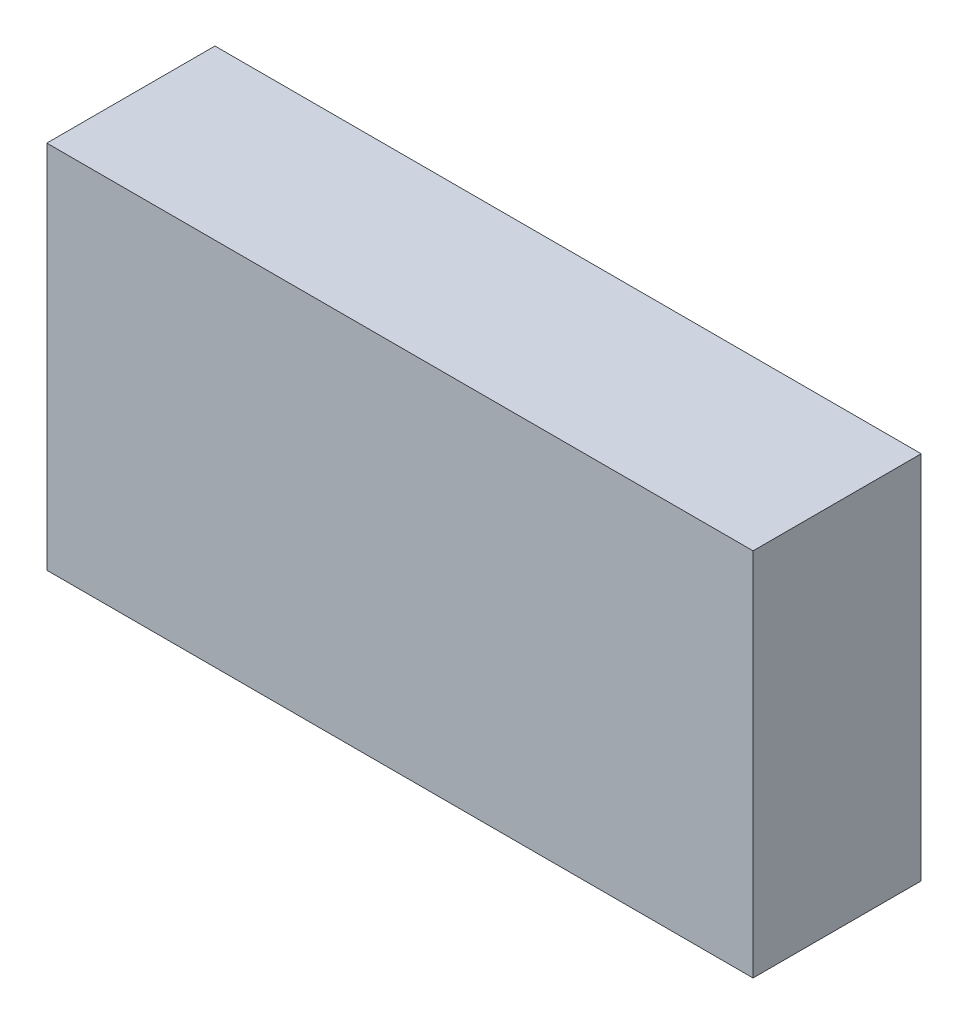
ISO-10303-21;
HEADER;
FILE_DESCRIPTION(('STEP AP214'),'2;1');
FILE_NAME('part.step','',(''),(''),'','','');
FILE_SCHEMA(('AUTOMOTIVE_DESIGN { 1 0 10303 214 1 1 1 1 }'));
ENDSEC;
DATA;
#1=APPLICATION_CONTEXT('core data for automotive mechanical design processes');
#2=APPLICATION_PROTOCOL_DEFINITION('international standard','automotive_design',2000,#1);
#3=PRODUCT_CONTEXT('',#1,'mechanical');
#4=PRODUCT('Part','Part','',(#3));
#5=PRODUCT_RELATED_PRODUCT_CATEGORY('part','',(#4));
#6=PRODUCT_DEFINITION_FORMATION('','',#4);
#7=PRODUCT_DEFINITION_CONTEXT('part definition',#1,'design');
#8=PRODUCT_DEFINITION('design','',#6,#7);
#9=PRODUCT_DEFINITION_SHAPE('','',#8);
#10=(LENGTH_UNIT() NAMED_UNIT(*) SI_UNIT(.MILLI.,.METRE.));
#11=(NAMED_UNIT(*) PLANE_ANGLE_UNIT() SI_UNIT($,.RADIAN.));
#12=(NAMED_UNIT(*) SI_UNIT($,.STERADIAN.) SOLID_ANGLE_UNIT());
#13=UNCERTAINTY_MEASURE_WITH_UNIT(LENGTH_MEASURE(1.E-05),#10,'distance_accuracy_value','');
#14=(GEOMETRIC_REPRESENTATION_CONTEXT(3) GLOBAL_UNCERTAINTY_ASSIGNED_CONTEXT((#13)) GLOBAL_UNIT_ASSIGNED_CONTEXT((#10,
#11,#12)) REPRESENTATION_CONTEXT('',''));
#15=CARTESIAN_POINT('',(0.,0.,0.));
#16=DIRECTION('',(0.,0.,1.));
#17=DIRECTION('',(1.,0.,0.));
#18=AXIS2_PLACEMENT_3D('',#15,#16,#17);
#19=CARTESIAN_POINT('',(21.,11.,-5.));
#20=DIRECTION('',(0.,0.,1.));
#21=DIRECTION('',(0.,-1.,0.));
#22=AXIS2_PLACEMENT_3D('',#19,#20,#21);
#23=PLANE('',#22);
#24=DIRECTION('',(0.,1.,0.));
#25=VECTOR('',#24,1.);
#26=CARTESIAN_POINT('',(-21.,11.,-5.));
#27=LINE('',#26,#25);
#28=CARTESIAN_POINT('',(-21.,-11.,-5.));
#29=VERTEX_POINT('',#28);
#30=CARTESIAN_POINT('',(-21.,11.,-5.));
#31=VERTEX_POINT('',#30);
#32=EDGE_CURVE('E100',#29,#31,#27,.T.);
#33=ORIENTED_EDGE('',*,*,#32,.T.);
#34=DIRECTION('',(-1.,0.,0.));
#35=VECTOR('',#34,1.);
#36=CARTESIAN_POINT('',(21.,11.,-5.));
#37=LINE('',#36,#35);
#38=CARTESIAN_POINT('',(21.,11.,-5.));
#39=VERTEX_POINT('',#38);
#40=EDGE_CURVE('E11',#39,#31,#37,.T.);
#41=ORIENTED_EDGE('',*,*,#40,.F.);
#42=DIRECTION('',(0.,1.,0.));
#43=VECTOR('',#42,1.);
#44=CARTESIAN_POINT('',(21.,11.,-5.));
#45=LINE('',#44,#43);
#46=CARTESIAN_POINT('',(21.,-11.,-5.));
#47=VERTEX_POINT('',#46);
#48=EDGE_CURVE('E88',#47,#39,#45,.T.);
#49=ORIENTED_EDGE('',*,*,#48,.F.);
#50=DIRECTION('',(-1.,0.,0.));
#51=VECTOR('',#50,1.);
#52=CARTESIAN_POINT('',(21.,-11.,-5.));
#53=LINE('',#52,#51);
#54=EDGE_CURVE('E96',#47,#29,#53,.T.);
#55=ORIENTED_EDGE('',*,*,#54,.T.);
#56=EDGE_LOOP('',(#33,#41,#49,#55));
#57=FACE_BOUND('',#56,.T.);
#58=ADVANCED_FACE('F37',(#57),#23,.F.);
#59=CARTESIAN_POINT('',(21.,11.,5.));
#60=DIRECTION('',(0.,-1.,0.));
#61=DIRECTION('',(0.,0.,-1.));
#62=AXIS2_PLACEMENT_3D('',#59,#60,#61);
#63=PLANE('',#62);
#64=DIRECTION('',(0.,0.,1.));
#65=VECTOR('',#64,1.);
#66=CARTESIAN_POINT('',(-21.,11.,5.));
#67=LINE('',#66,#65);
#68=CARTESIAN_POINT('',(-21.,11.,5.));
#69=VERTEX_POINT('',#68);
#70=EDGE_CURVE('E92',#31,#69,#67,.T.);
#71=ORIENTED_EDGE('',*,*,#70,.T.);
#72=DIRECTION('',(-1.,0.,0.));
#73=VECTOR('',#72,1.);
#74=CARTESIAN_POINT('',(21.,11.,5.));
#75=LINE('',#74,#73);
#76=CARTESIAN_POINT('',(21.,11.,5.));
#77=VERTEX_POINT('',#76);
#78=EDGE_CURVE('E45',#77,#69,#75,.T.);
#79=ORIENTED_EDGE('',*,*,#78,.F.);
#80=DIRECTION('',(0.,0.,1.));
#81=VECTOR('',#80,1.);
#82=CARTESIAN_POINT('',(21.,11.,5.));
#83=LINE('',#82,#81);
#84=EDGE_CURVE('E83',#39,#77,#83,.T.);
#85=ORIENTED_EDGE('',*,*,#84,.F.);
#86=ORIENTED_EDGE('',*,*,#40,.T.);
#87=EDGE_LOOP('',(#71,#79,#85,#86));
#88=FACE_BOUND('',#87,.T.);
#89=ADVANCED_FACE('F91',(#88),#63,.F.);
#90=CARTESIAN_POINT('',(21.,11.,5.));
#91=DIRECTION('',(0.,0.,-1.));
#92=DIRECTION('',(0.,1.,0.));
#93=AXIS2_PLACEMENT_3D('',#90,#91,#92);
#94=PLANE('',#93);
#95=DIRECTION('',(0.,-1.,0.));
#96=VECTOR('',#95,1.);
#97=CARTESIAN_POINT('',(-21.,11.,5.));
#98=LINE('',#97,#96);
#99=CARTESIAN_POINT('',(-21.,-11.,5.));
#100=VERTEX_POINT('',#99);
#101=EDGE_CURVE('E70',#69,#100,#98,.T.);
#102=ORIENTED_EDGE('',*,*,#101,.T.);
#103=DIRECTION('',(-1.,0.,0.));
#104=VECTOR('',#103,1.);
#105=CARTESIAN_POINT('',(21.,-11.,5.));
#106=LINE('',#105,#104);
#107=CARTESIAN_POINT('',(21.,-11.,5.));
#108=VERTEX_POINT('',#107);
#109=EDGE_CURVE('E93',#108,#100,#106,.T.);
#110=ORIENTED_EDGE('',*,*,#109,.F.);
#111=DIRECTION('',(0.,-1.,0.));
#112=VECTOR('',#111,1.);
#113=CARTESIAN_POINT('',(21.,11.,5.));
#114=LINE('',#113,#112);
#115=EDGE_CURVE('E86',#77,#108,#114,.T.);
#116=ORIENTED_EDGE('',*,*,#115,.F.);
#117=ORIENTED_EDGE('',*,*,#78,.T.);
#118=EDGE_LOOP('',(#102,#110,#116,#117));
#119=FACE_BOUND('',#118,.T.);
#120=ADVANCED_FACE('F94',(#119),#94,.F.);
#121=CARTESIAN_POINT('',(21.,-11.,5.));
#122=DIRECTION('',(0.,1.,0.));
#123=DIRECTION('',(0.,0.,1.));
#124=AXIS2_PLACEMENT_3D('',#121,#122,#123);
#125=PLANE('',#124);
#126=CARTESIAN_POINT('',(-16.,-11.,0.));
#127=DIRECTION('',(0.,-1.,0.));
#128=DIRECTION('',(0.,0.,-1.));
#129=AXIS2_PLACEMENT_3D('',#126,#127,#128);
#130=CIRCLE('',#129,2.);
#131=CARTESIAN_POINT('',(-16.,-11.,-2.));
#132=VERTEX_POINT('',#131);
#133=EDGE_CURVE('E120',#132,#132,#130,.T.);
#134=ORIENTED_EDGE('',*,*,#133,.F.);
#135=EDGE_LOOP('',(#134));
#136=FACE_BOUND('',#135,.T.);
#137=CARTESIAN_POINT('',(-5.,-11.,0.));
#138=DIRECTION('',(0.,-1.,0.));
#139=DIRECTION('',(0.,0.,-1.));
#140=AXIS2_PLACEMENT_3D('',#137,#138,#139);
#141=CIRCLE('',#140,2.);
#142=CARTESIAN_POINT('',(-5.,-11.,-2.));
#143=VERTEX_POINT('',#142);
#144=EDGE_CURVE('E117',#143,#143,#141,.T.);
#145=ORIENTED_EDGE('',*,*,#144,.F.);
#146=EDGE_LOOP('',(#145));
#147=FACE_BOUND('',#146,.T.);
#148=DIRECTION('',(0.,0.,-1.));
#149=VECTOR('',#148,1.);
#150=CARTESIAN_POINT('',(-21.,-11.,5.));
#151=LINE('',#150,#149);
#152=EDGE_CURVE('E76',#100,#29,#151,.T.);
#153=ORIENTED_EDGE('',*,*,#152,.T.);
#154=ORIENTED_EDGE('',*,*,#54,.F.);
#155=DIRECTION('',(0.,0.,-1.));
#156=VECTOR('',#155,1.);
#157=CARTESIAN_POINT('',(21.,-11.,5.));
#158=LINE('',#157,#156);
#159=EDGE_CURVE('E53',#108,#47,#158,.T.);
#160=ORIENTED_EDGE('',*,*,#159,.F.);
#161=ORIENTED_EDGE('',*,*,#109,.T.);
#162=EDGE_LOOP('',(#153,#154,#160,#161));
#163=FACE_BOUND('',#162,.T.);
#164=ADVANCED_FACE('F108',(#136,#147,#163),#125,.F.);
#165=CARTESIAN_POINT('',(21.,0.,0.));
#166=DIRECTION('',(1.,0.,0.));
#167=DIRECTION('',(0.,0.,-1.));
#168=AXIS2_PLACEMENT_3D('',#165,#166,#167);
#169=PLANE('',#168);
#170=ORIENTED_EDGE('',*,*,#48,.T.);
#171=ORIENTED_EDGE('',*,*,#84,.T.);
#172=ORIENTED_EDGE('',*,*,#115,.T.);
#173=ORIENTED_EDGE('',*,*,#159,.T.);
#174=EDGE_LOOP('',(#170,#171,#172,#173));
#175=FACE_BOUND('',#174,.T.);
#176=ADVANCED_FACE('F84',(#175),#169,.T.);
#177=CARTESIAN_POINT('',(-21.,0.,0.));
#178=DIRECTION('',(1.,0.,0.));
#179=DIRECTION('',(0.,0.,-1.));
#180=AXIS2_PLACEMENT_3D('',#177,#178,#179);
#181=PLANE('',#180);
#182=ORIENTED_EDGE('',*,*,#32,.F.);
#183=ORIENTED_EDGE('',*,*,#152,.F.);
#184=ORIENTED_EDGE('',*,*,#101,.F.);
#185=ORIENTED_EDGE('',*,*,#70,.F.);
#186=EDGE_LOOP('',(#182,#183,#184,#185));
#187=FACE_BOUND('',#186,.T.);
#188=ADVANCED_FACE('F111',(#187),#181,.F.);
#189=CARTESIAN_POINT('',(-5.,-6.,0.));
#190=DIRECTION('',(0.,-1.,0.));
#191=DIRECTION('',(0.,0.,-1.));
#192=AXIS2_PLACEMENT_3D('',#189,#190,#191);
#193=CYLINDRICAL_SURFACE('',#192,2.);
#194=CARTESIAN_POINT('',(-5.,-6.,0.));
#195=DIRECTION('',(0.,-1.,0.));
#196=DIRECTION('',(0.,0.,-1.));
#197=AXIS2_PLACEMENT_3D('',#194,#195,#196);
#198=CIRCLE('',#197,2.);
#199=CARTESIAN_POINT('',(-5.,-6.,-2.));
#200=VERTEX_POINT('',#199);
#201=EDGE_CURVE('E114',#200,#200,#198,.T.);
#202=ORIENTED_EDGE('',*,*,#201,.F.);
#203=EDGE_LOOP('',(#202));
#204=FACE_BOUND('',#203,.T.);
#205=ORIENTED_EDGE('',*,*,#144,.T.);
#206=EDGE_LOOP('',(#205));
#207=FACE_BOUND('',#206,.T.);
#208=ADVANCED_FACE('F140',(#204,#207),#193,.F.);
#209=CARTESIAN_POINT('',(-5.,-6.,0.));
#210=DIRECTION('',(0.,-1.,0.));
#211=DIRECTION('',(0.,0.,-1.));
#212=AXIS2_PLACEMENT_3D('',#209,#210,#211);
#213=PLANE('',#212);
#214=ORIENTED_EDGE('',*,*,#201,.T.);
#215=EDGE_LOOP('',(#214));
#216=FACE_BOUND('',#215,.T.);
#217=ADVANCED_FACE('F131',(#216),#213,.T.);
#218=CARTESIAN_POINT('',(-16.,-6.,0.));
#219=DIRECTION('',(0.,-1.,0.));
#220=DIRECTION('',(0.,0.,-1.));
#221=AXIS2_PLACEMENT_3D('',#218,#219,#220);
#222=CYLINDRICAL_SURFACE('',#221,2.);
#223=CARTESIAN_POINT('',(-16.,-6.,0.));
#224=DIRECTION('',(0.,-1.,0.));
#225=DIRECTION('',(0.,0.,-1.));
#226=AXIS2_PLACEMENT_3D('',#223,#224,#225);
#227=CIRCLE('',#226,2.);
#228=CARTESIAN_POINT('',(-16.,-6.,-2.));
#229=VERTEX_POINT('',#228);
#230=EDGE_CURVE('E103',#229,#229,#227,.T.);
#231=ORIENTED_EDGE('',*,*,#230,.F.);
#232=EDGE_LOOP('',(#231));
#233=FACE_BOUND('',#232,.T.);
#234=ORIENTED_EDGE('',*,*,#133,.T.);
#235=EDGE_LOOP('',(#234));
#236=FACE_BOUND('',#235,.T.);
#237=ADVANCED_FACE('F128',(#233,#236),#222,.F.);
#238=CARTESIAN_POINT('',(-16.,-6.,0.));
#239=DIRECTION('',(0.,-1.,0.));
#240=DIRECTION('',(0.,0.,-1.));
#241=AXIS2_PLACEMENT_3D('',#238,#239,#240);
#242=PLANE('',#241);
#243=ORIENTED_EDGE('',*,*,#230,.T.);
#244=EDGE_LOOP('',(#243));
#245=FACE_BOUND('',#244,.T.);
#246=ADVANCED_FACE('F126',(#245),#242,.T.);
#247=CLOSED_SHELL('',(#58,#89,#120,#164,#176,#188,#208,#217,#237,#246));
#248=MANIFOLD_SOLID_BREP('B2',#247);
#249=ADVANCED_BREP_SHAPE_REPRESENTATION('',(#18,#248),#14);
#250=SHAPE_DEFINITION_REPRESENTATION(#9,#249);
ENDSEC;
END-ISO-10303-21;
